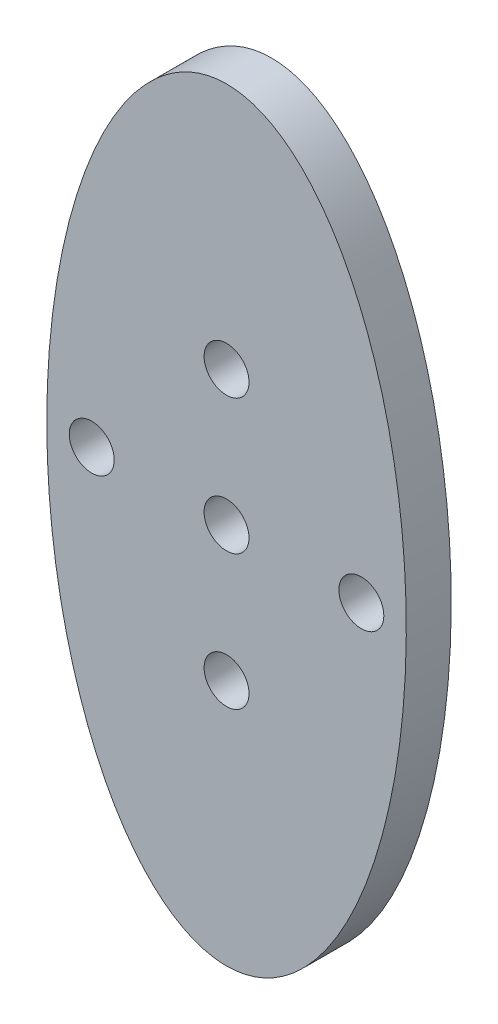
ISO-10303-21;
HEADER;
FILE_DESCRIPTION(('STEP AP214'),'2;1');
FILE_NAME('part.step','',(''),(''),'','','');
FILE_SCHEMA(('AUTOMOTIVE_DESIGN { 1 0 10303 214 1 1 1 1 }'));
ENDSEC;
DATA;
#1=APPLICATION_CONTEXT('core data for automotive mechanical design processes');
#2=APPLICATION_PROTOCOL_DEFINITION('international standard','automotive_design',2000,#1);
#3=PRODUCT_CONTEXT('',#1,'mechanical');
#4=PRODUCT('Part','Part','',(#3));
#5=PRODUCT_RELATED_PRODUCT_CATEGORY('part','',(#4));
#6=PRODUCT_DEFINITION_FORMATION('','',#4);
#7=PRODUCT_DEFINITION_CONTEXT('part definition',#1,'design');
#8=PRODUCT_DEFINITION('design','',#6,#7);
#9=PRODUCT_DEFINITION_SHAPE('','',#8);
#10=(LENGTH_UNIT() NAMED_UNIT(*) SI_UNIT(.MILLI.,.METRE.));
#11=(NAMED_UNIT(*) PLANE_ANGLE_UNIT() SI_UNIT($,.RADIAN.));
#12=(NAMED_UNIT(*) SI_UNIT($,.STERADIAN.) SOLID_ANGLE_UNIT());
#13=UNCERTAINTY_MEASURE_WITH_UNIT(LENGTH_MEASURE(1.E-05),#10,'distance_accuracy_value','');
#14=(GEOMETRIC_REPRESENTATION_CONTEXT(3) GLOBAL_UNCERTAINTY_ASSIGNED_CONTEXT((#13)) GLOBAL_UNIT_ASSIGNED_CONTEXT((#10,
#11,#12)) REPRESENTATION_CONTEXT('',''));
#15=CARTESIAN_POINT('',(0.,0.,0.));
#16=DIRECTION('',(0.,0.,1.));
#17=DIRECTION('',(1.,0.,0.));
#18=AXIS2_PLACEMENT_3D('',#15,#16,#17);
#19=CARTESIAN_POINT('',(299.5187540025,285.8788155958,3.));
#20=DIRECTION('',(0.,0.,1.));
#21=DIRECTION('',(1.,0.,0.));
#22=AXIS2_PLACEMENT_3D('',#19,#20,#21);
#23=PLANE('',#22);
#24=CARTESIAN_POINT('',(290.5187540025,285.8788155958,3.));
#25=DIRECTION('',(0.,0.,1.));
#26=DIRECTION('',(1.,0.,0.));
#27=AXIS2_PLACEMENT_3D('',#24,#25,#26);
#28=CIRCLE('',#27,1.5);
#29=CARTESIAN_POINT('',(292.0187540025,285.8788155958,3.));
#30=VERTEX_POINT('',#29);
#31=EDGE_CURVE('E59',#30,#30,#28,.T.);
#32=ORIENTED_EDGE('',*,*,#31,.F.);
#33=EDGE_LOOP('',(#32));
#34=FACE_BOUND('',#33,.T.);
#35=CARTESIAN_POINT('',(299.5187540025,294.8788155958,3.));
#36=DIRECTION('',(0.,0.,1.));
#37=DIRECTION('',(1.,0.,0.));
#38=AXIS2_PLACEMENT_3D('',#35,#36,#37);
#39=CIRCLE('',#38,1.5);
#40=CARTESIAN_POINT('',(301.0187540025,294.8788155958,3.));
#41=VERTEX_POINT('',#40);
#42=EDGE_CURVE('E47',#41,#41,#39,.T.);
#43=ORIENTED_EDGE('',*,*,#42,.F.);
#44=EDGE_LOOP('',(#43));
#45=FACE_BOUND('',#44,.T.);
#46=CARTESIAN_POINT('',(299.5187540025,285.8788155958,3.));
#47=DIRECTION('',(0.,0.,1.));
#48=DIRECTION('',(0.,-1.,0.));
#49=AXIS2_PLACEMENT_3D('',#46,#47,#48);
#50=ELLIPSE('',#49,25.5,12.00000000015);
#51=CARTESIAN_POINT('',(299.5187540025,260.3788155958,3.));
#52=VERTEX_POINT('',#51);
#53=EDGE_CURVE('E10',#52,#52,#50,.T.);
#54=ORIENTED_EDGE('',*,*,#53,.T.);
#55=EDGE_LOOP('',(#54));
#56=FACE_BOUND('',#55,.T.);
#57=CARTESIAN_POINT('',(299.5187540025,276.8788155958,3.));
#58=DIRECTION('',(0.,0.,1.));
#59=DIRECTION('',(1.,0.,0.));
#60=AXIS2_PLACEMENT_3D('',#57,#58,#59);
#61=CIRCLE('',#60,1.5);
#62=CARTESIAN_POINT('',(301.0187540025,276.8788155958,3.));
#63=VERTEX_POINT('',#62);
#64=EDGE_CURVE('E41',#63,#63,#61,.T.);
#65=ORIENTED_EDGE('',*,*,#64,.F.);
#66=EDGE_LOOP('',(#65));
#67=FACE_BOUND('',#66,.T.);
#68=CARTESIAN_POINT('',(308.5187540025,285.8788155958,3.));
#69=DIRECTION('',(0.,0.,1.));
#70=DIRECTION('',(1.,0.,0.));
#71=AXIS2_PLACEMENT_3D('',#68,#69,#70);
#72=CIRCLE('',#71,1.5);
#73=CARTESIAN_POINT('',(310.0187540025,285.8788155958,3.));
#74=VERTEX_POINT('',#73);
#75=EDGE_CURVE('E53',#74,#74,#72,.T.);
#76=ORIENTED_EDGE('',*,*,#75,.F.);
#77=EDGE_LOOP('',(#76));
#78=FACE_BOUND('',#77,.T.);
#79=CARTESIAN_POINT('',(299.5187540025,285.8788155958,3.));
#80=DIRECTION('',(0.,0.,1.));
#81=DIRECTION('',(1.,0.,0.));
#82=AXIS2_PLACEMENT_3D('',#79,#80,#81);
#83=CIRCLE('',#82,1.5);
#84=CARTESIAN_POINT('',(301.0187540025,285.8788155958,3.));
#85=VERTEX_POINT('',#84);
#86=EDGE_CURVE('E65',#85,#85,#83,.T.);
#87=ORIENTED_EDGE('',*,*,#86,.F.);
#88=EDGE_LOOP('',(#87));
#89=FACE_BOUND('',#88,.T.);
#90=ADVANCED_FACE('F30',(#34,#45,#56,#67,#78,#89),#23,.T.);
#91=CARTESIAN_POINT('',(299.5187540025,285.8788155958,0.));
#92=DIRECTION('',(0.,0.,1.));
#93=DIRECTION('',(1.,0.,0.));
#94=AXIS2_PLACEMENT_3D('',#91,#92,#93);
#95=PLANE('',#94);
#96=CARTESIAN_POINT('',(290.5187540025,285.8788155958,0.));
#97=DIRECTION('',(0.,0.,1.));
#98=DIRECTION('',(1.,0.,0.));
#99=AXIS2_PLACEMENT_3D('',#96,#97,#98);
#100=CIRCLE('',#99,1.5);
#101=CARTESIAN_POINT('',(292.0187540025,285.8788155958,0.));
#102=VERTEX_POINT('',#101);
#103=EDGE_CURVE('E62',#102,#102,#100,.T.);
#104=ORIENTED_EDGE('',*,*,#103,.T.);
#105=EDGE_LOOP('',(#104));
#106=FACE_BOUND('',#105,.T.);
#107=CARTESIAN_POINT('',(299.5187540025,294.8788155958,0.));
#108=DIRECTION('',(0.,0.,1.));
#109=DIRECTION('',(1.,0.,0.));
#110=AXIS2_PLACEMENT_3D('',#107,#108,#109);
#111=CIRCLE('',#110,1.5);
#112=CARTESIAN_POINT('',(301.0187540025,294.8788155958,0.));
#113=VERTEX_POINT('',#112);
#114=EDGE_CURVE('E50',#113,#113,#111,.T.);
#115=ORIENTED_EDGE('',*,*,#114,.T.);
#116=EDGE_LOOP('',(#115));
#117=FACE_BOUND('',#116,.T.);
#118=CARTESIAN_POINT('',(299.5187540025,285.8788155958,0.));
#119=DIRECTION('',(0.,0.,1.));
#120=DIRECTION('',(0.,-1.,0.));
#121=AXIS2_PLACEMENT_3D('',#118,#119,#120);
#122=ELLIPSE('',#121,25.5,12.00000000015);
#123=CARTESIAN_POINT('',(299.5187540025,260.3788155958,0.));
#124=VERTEX_POINT('',#123);
#125=EDGE_CURVE('E35',#124,#124,#122,.T.);
#126=ORIENTED_EDGE('',*,*,#125,.F.);
#127=EDGE_LOOP('',(#126));
#128=FACE_BOUND('',#127,.T.);
#129=CARTESIAN_POINT('',(299.5187540025,276.8788155958,0.));
#130=DIRECTION('',(0.,0.,1.));
#131=DIRECTION('',(1.,0.,0.));
#132=AXIS2_PLACEMENT_3D('',#129,#130,#131);
#133=CIRCLE('',#132,1.5);
#134=CARTESIAN_POINT('',(301.0187540025,276.8788155958,0.));
#135=VERTEX_POINT('',#134);
#136=EDGE_CURVE('E44',#135,#135,#133,.T.);
#137=ORIENTED_EDGE('',*,*,#136,.T.);
#138=EDGE_LOOP('',(#137));
#139=FACE_BOUND('',#138,.T.);
#140=CARTESIAN_POINT('',(308.5187540025,285.8788155958,0.));
#141=DIRECTION('',(0.,0.,1.));
#142=DIRECTION('',(1.,0.,0.));
#143=AXIS2_PLACEMENT_3D('',#140,#141,#142);
#144=CIRCLE('',#143,1.5);
#145=CARTESIAN_POINT('',(310.0187540025,285.8788155958,0.));
#146=VERTEX_POINT('',#145);
#147=EDGE_CURVE('E56',#146,#146,#144,.T.);
#148=ORIENTED_EDGE('',*,*,#147,.T.);
#149=EDGE_LOOP('',(#148));
#150=FACE_BOUND('',#149,.T.);
#151=CARTESIAN_POINT('',(299.5187540025,285.8788155958,0.));
#152=DIRECTION('',(0.,0.,1.));
#153=DIRECTION('',(1.,0.,0.));
#154=AXIS2_PLACEMENT_3D('',#151,#152,#153);
#155=CIRCLE('',#154,1.5);
#156=CARTESIAN_POINT('',(301.0187540025,285.8788155958,0.));
#157=VERTEX_POINT('',#156);
#158=EDGE_CURVE('E68',#157,#157,#155,.T.);
#159=ORIENTED_EDGE('',*,*,#158,.T.);
#160=EDGE_LOOP('',(#159));
#161=FACE_BOUND('',#160,.T.);
#162=ADVANCED_FACE('F78',(#106,#117,#128,#139,#150,#161),#95,.F.);
#163=DIRECTION('',(0.,0.,-1.));
#164=VECTOR('',#163,1.);
#165=SURFACE_OF_LINEAR_EXTRUSION('',#50,#164);
#166=ORIENTED_EDGE('',*,*,#53,.F.);
#167=EDGE_LOOP('',(#166));
#168=FACE_BOUND('',#167,.T.);
#169=ORIENTED_EDGE('',*,*,#125,.T.);
#170=EDGE_LOOP('',(#169));
#171=FACE_BOUND('',#170,.T.);
#172=ADVANCED_FACE('F32',(#168,#171),#165,.F.);
#173=CARTESIAN_POINT('',(299.5187540025,276.8788155958,3.));
#174=DIRECTION('',(0.,0.,-1.));
#175=DIRECTION('',(-1.,0.,0.));
#176=AXIS2_PLACEMENT_3D('',#173,#174,#175);
#177=CYLINDRICAL_SURFACE('',#176,1.5);
#178=ORIENTED_EDGE('',*,*,#64,.T.);
#179=EDGE_LOOP('',(#178));
#180=FACE_BOUND('',#179,.T.);
#181=ORIENTED_EDGE('',*,*,#136,.F.);
#182=EDGE_LOOP('',(#181));
#183=FACE_BOUND('',#182,.T.);
#184=ADVANCED_FACE('F88',(#180,#183),#177,.F.);
#185=CARTESIAN_POINT('',(299.5187540025,294.8788155958,3.));
#186=DIRECTION('',(0.,0.,-1.));
#187=DIRECTION('',(-1.,0.,0.));
#188=AXIS2_PLACEMENT_3D('',#185,#186,#187);
#189=CYLINDRICAL_SURFACE('',#188,1.5);
#190=ORIENTED_EDGE('',*,*,#42,.T.);
#191=EDGE_LOOP('',(#190));
#192=FACE_BOUND('',#191,.T.);
#193=ORIENTED_EDGE('',*,*,#114,.F.);
#194=EDGE_LOOP('',(#193));
#195=FACE_BOUND('',#194,.T.);
#196=ADVANCED_FACE('F91',(#192,#195),#189,.F.);
#197=CARTESIAN_POINT('',(308.5187540025,285.8788155958,3.));
#198=DIRECTION('',(0.,0.,-1.));
#199=DIRECTION('',(-1.,0.,0.));
#200=AXIS2_PLACEMENT_3D('',#197,#198,#199);
#201=CYLINDRICAL_SURFACE('',#200,1.5);
#202=ORIENTED_EDGE('',*,*,#75,.T.);
#203=EDGE_LOOP('',(#202));
#204=FACE_BOUND('',#203,.T.);
#205=ORIENTED_EDGE('',*,*,#147,.F.);
#206=EDGE_LOOP('',(#205));
#207=FACE_BOUND('',#206,.T.);
#208=ADVANCED_FACE('F95',(#204,#207),#201,.F.);
#209=CARTESIAN_POINT('',(290.5187540025,285.8788155958,3.));
#210=DIRECTION('',(0.,0.,-1.));
#211=DIRECTION('',(-1.,0.,0.));
#212=AXIS2_PLACEMENT_3D('',#209,#210,#211);
#213=CYLINDRICAL_SURFACE('',#212,1.5);
#214=ORIENTED_EDGE('',*,*,#31,.T.);
#215=EDGE_LOOP('',(#214));
#216=FACE_BOUND('',#215,.T.);
#217=ORIENTED_EDGE('',*,*,#103,.F.);
#218=EDGE_LOOP('',(#217));
#219=FACE_BOUND('',#218,.T.);
#220=ADVANCED_FACE('F99',(#216,#219),#213,.F.);
#221=CARTESIAN_POINT('',(299.5187540025,285.8788155958,3.));
#222=DIRECTION('',(0.,0.,-1.));
#223=DIRECTION('',(-1.,0.,0.));
#224=AXIS2_PLACEMENT_3D('',#221,#222,#223);
#225=CYLINDRICAL_SURFACE('',#224,1.5);
#226=ORIENTED_EDGE('',*,*,#86,.T.);
#227=EDGE_LOOP('',(#226));
#228=FACE_BOUND('',#227,.T.);
#229=ORIENTED_EDGE('',*,*,#158,.F.);
#230=EDGE_LOOP('',(#229));
#231=FACE_BOUND('',#230,.T.);
#232=ADVANCED_FACE('F74',(#228,#231),#225,.F.);
#233=CLOSED_SHELL('',(#90,#162,#172,#184,#196,#208,#220,#232));
#234=MANIFOLD_SOLID_BREP('B2',#233);
#235=ADVANCED_BREP_SHAPE_REPRESENTATION('',(#18,#234),#14);
#236=SHAPE_DEFINITION_REPRESENTATION(#9,#235);
ENDSEC;
END-ISO-10303-21;
